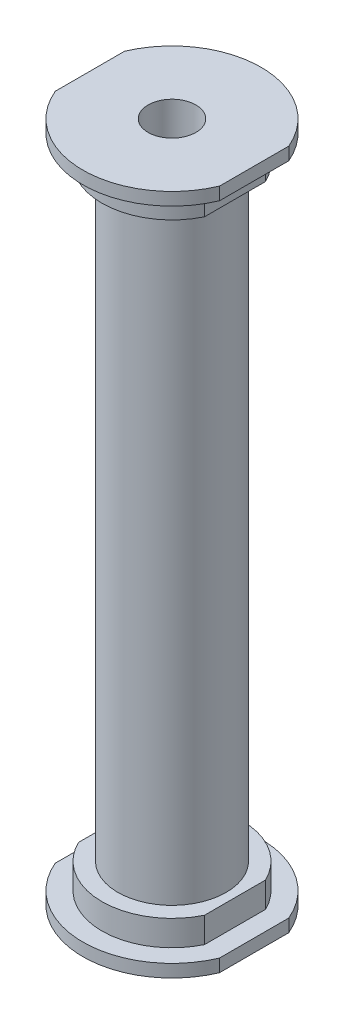
ISO-10303-21;
HEADER;
FILE_DESCRIPTION(('STEP AP214'),'2;1');
FILE_NAME('part.step','',(''),(''),'','','');
FILE_SCHEMA(('AUTOMOTIVE_DESIGN { 1 0 10303 214 1 1 1 1 }'));
ENDSEC;
DATA;
#1=APPLICATION_CONTEXT('core data for automotive mechanical design processes');
#2=APPLICATION_PROTOCOL_DEFINITION('international standard','automotive_design',2000,#1);
#3=PRODUCT_CONTEXT('',#1,'mechanical');
#4=PRODUCT('Part','Part','',(#3));
#5=PRODUCT_RELATED_PRODUCT_CATEGORY('part','',(#4));
#6=PRODUCT_DEFINITION_FORMATION('','',#4);
#7=PRODUCT_DEFINITION_CONTEXT('part definition',#1,'design');
#8=PRODUCT_DEFINITION('design','',#6,#7);
#9=PRODUCT_DEFINITION_SHAPE('','',#8);
#10=(LENGTH_UNIT() NAMED_UNIT(*) SI_UNIT(.MILLI.,.METRE.));
#11=(NAMED_UNIT(*) PLANE_ANGLE_UNIT() SI_UNIT($,.RADIAN.));
#12=(NAMED_UNIT(*) SI_UNIT($,.STERADIAN.) SOLID_ANGLE_UNIT());
#13=UNCERTAINTY_MEASURE_WITH_UNIT(LENGTH_MEASURE(1.E-05),#10,'distance_accuracy_value','');
#14=(GEOMETRIC_REPRESENTATION_CONTEXT(3) GLOBAL_UNCERTAINTY_ASSIGNED_CONTEXT((#13)) GLOBAL_UNIT_ASSIGNED_CONTEXT((#10,
#11,#12)) REPRESENTATION_CONTEXT('',''));
#15=CARTESIAN_POINT('',(0.,0.,0.));
#16=DIRECTION('',(0.,0.,1.));
#17=DIRECTION('',(1.,0.,0.));
#18=AXIS2_PLACEMENT_3D('',#15,#16,#17);
#19=CARTESIAN_POINT('',(0.,83.35,0.));
#20=DIRECTION('',(0.,-1.,0.));
#21=DIRECTION('',(-1.,0.,0.));
#22=AXIS2_PLACEMENT_3D('',#19,#20,#21);
#23=CYLINDRICAL_SURFACE('',#22,3.75);
#24=CARTESIAN_POINT('',(0.,54.35,0.));
#25=DIRECTION('',(0.,1.,0.));
#26=DIRECTION('',(-1.,0.,0.));
#27=AXIS2_PLACEMENT_3D('',#24,#25,#26);
#28=CIRCLE('',#27,3.75);
#29=CARTESIAN_POINT('',(-3.75,54.35,0.));
#30=VERTEX_POINT('',#29);
#31=EDGE_CURVE('E252',#30,#30,#28,.T.);
#32=ORIENTED_EDGE('',*,*,#31,.T.);
#33=EDGE_LOOP('',(#32));
#34=FACE_BOUND('',#33,.T.);
#35=CARTESIAN_POINT('',(0.,-52.65,0.));
#36=DIRECTION('',(0.,1.,0.));
#37=DIRECTION('',(-1.,0.,0.));
#38=AXIS2_PLACEMENT_3D('',#35,#36,#37);
#39=CIRCLE('',#38,3.75);
#40=CARTESIAN_POINT('',(-3.75,-52.65,0.));
#41=VERTEX_POINT('',#40);
#42=EDGE_CURVE('E208',#41,#41,#39,.T.);
#43=ORIENTED_EDGE('',*,*,#42,.F.);
#44=EDGE_LOOP('',(#43));
#45=FACE_BOUND('',#44,.T.);
#46=ADVANCED_FACE('F51',(#34,#45),#23,.F.);
#47=CARTESIAN_POINT('',(0.,48.35,0.));
#48=DIRECTION('',(0.,1.,0.));
#49=DIRECTION('',(-1.,0.,0.));
#50=AXIS2_PLACEMENT_3D('',#47,#48,#49);
#51=PLANE('',#50);
#52=CARTESIAN_POINT('',(0.,48.35,0.));
#53=DIRECTION('',(0.,-1.,0.));
#54=DIRECTION('',(1.,0.,0.));
#55=AXIS2_PLACEMENT_3D('',#52,#53,#54);
#56=CIRCLE('',#55,8.5);
#57=CARTESIAN_POINT('',(8.5,48.35,0.));
#58=VERTEX_POINT('',#57);
#59=EDGE_CURVE('E11',#58,#58,#56,.T.);
#60=ORIENTED_EDGE('',*,*,#59,.F.);
#61=EDGE_LOOP('',(#60));
#62=FACE_BOUND('',#61,.T.);
#63=CARTESIAN_POINT('',(0.,48.35,0.));
#64=DIRECTION('',(0.,1.,0.));
#65=DIRECTION('',(-1.,0.,0.));
#66=AXIS2_PLACEMENT_3D('',#63,#64,#65);
#67=CIRCLE('',#66,11.);
#68=CARTESIAN_POINT('',(-9.89999999999999,48.35,4.79478883789479));
#69=VERTEX_POINT('',#68);
#70=CARTESIAN_POINT('',(9.90000000000001,48.35,4.79478883789478));
#71=VERTEX_POINT('',#70);
#72=EDGE_CURVE('E286',#69,#71,#67,.T.);
#73=ORIENTED_EDGE('',*,*,#72,.F.);
#74=DIRECTION('',(0.,0.,1.));
#75=VECTOR('',#74,1.);
#76=CARTESIAN_POINT('',(-9.89999999999999,48.35,4.79478883789479));
#77=LINE('',#76,#75);
#78=CARTESIAN_POINT('',(-9.89999999999999,48.35,-4.79478883789479));
#79=VERTEX_POINT('',#78);
#80=EDGE_CURVE('E89',#79,#69,#77,.T.);
#81=ORIENTED_EDGE('',*,*,#80,.F.);
#82=CARTESIAN_POINT('',(0.,48.35,0.));
#83=DIRECTION('',(0.,1.,0.));
#84=DIRECTION('',(1.,0.,0.));
#85=AXIS2_PLACEMENT_3D('',#82,#83,#84);
#86=CIRCLE('',#85,11.);
#87=CARTESIAN_POINT('',(9.90000000000001,48.35,-4.79478883789479));
#88=VERTEX_POINT('',#87);
#89=EDGE_CURVE('E84',#88,#79,#86,.T.);
#90=ORIENTED_EDGE('',*,*,#89,.F.);
#91=DIRECTION('',(0.,0.,-1.));
#92=VECTOR('',#91,1.);
#93=CARTESIAN_POINT('',(9.90000000000001,48.35,-4.79478883789478));
#94=LINE('',#93,#92);
#95=EDGE_CURVE('E300',#71,#88,#94,.T.);
#96=ORIENTED_EDGE('',*,*,#95,.F.);
#97=EDGE_LOOP('',(#73,#81,#90,#96));
#98=FACE_BOUND('',#97,.T.);
#99=ADVANCED_FACE('F311',(#62,#98),#51,.F.);
#100=CARTESIAN_POINT('',(0.,52.35,0.));
#101=DIRECTION('',(0.,-1.,0.));
#102=DIRECTION('',(1.,0.,0.));
#103=AXIS2_PLACEMENT_3D('',#100,#101,#102);
#104=CYLINDRICAL_SURFACE('',#103,11.);
#105=ORIENTED_EDGE('',*,*,#72,.T.);
#106=DIRECTION('',(0.,-1.,0.));
#107=VECTOR('',#106,1.);
#108=CARTESIAN_POINT('',(9.90000000000001,52.35,4.79478883789478));
#109=LINE('',#108,#107);
#110=CARTESIAN_POINT('',(9.90000000000001,52.35,4.79478883789478));
#111=VERTEX_POINT('',#110);
#112=EDGE_CURVE('E54',#111,#71,#109,.T.);
#113=ORIENTED_EDGE('',*,*,#112,.F.);
#114=CARTESIAN_POINT('',(0.,52.35,0.));
#115=DIRECTION('',(0.,1.,0.));
#116=DIRECTION('',(-1.,0.,0.));
#117=AXIS2_PLACEMENT_3D('',#114,#115,#116);
#118=CIRCLE('',#117,11.);
#119=CARTESIAN_POINT('',(-9.89999999999999,52.35,4.79478883789479));
#120=VERTEX_POINT('',#119);
#121=EDGE_CURVE('E287',#120,#111,#118,.T.);
#122=ORIENTED_EDGE('',*,*,#121,.F.);
#123=DIRECTION('',(0.,-1.,0.));
#124=VECTOR('',#123,1.);
#125=CARTESIAN_POINT('',(-9.89999999999999,52.35,4.79478883789479));
#126=LINE('',#125,#124);
#127=EDGE_CURVE('E297',#120,#69,#126,.T.);
#128=ORIENTED_EDGE('',*,*,#127,.T.);
#129=EDGE_LOOP('',(#105,#113,#122,#128));
#130=FACE_BOUND('',#129,.T.);
#131=ADVANCED_FACE('F309',(#130),#104,.T.);
#132=CARTESIAN_POINT('',(9.90000000000001,52.35,-4.79478883789478));
#133=DIRECTION('',(-1.,0.,0.));
#134=DIRECTION('',(0.,-1.,0.));
#135=AXIS2_PLACEMENT_3D('',#132,#133,#134);
#136=PLANE('',#135);
#137=ORIENTED_EDGE('',*,*,#95,.T.);
#138=DIRECTION('',(0.,-1.,0.));
#139=VECTOR('',#138,1.);
#140=CARTESIAN_POINT('',(9.90000000000001,52.35,-4.79478883789479));
#141=LINE('',#140,#139);
#142=CARTESIAN_POINT('',(9.90000000000001,52.35,-4.79478883789479));
#143=VERTEX_POINT('',#142);
#144=EDGE_CURVE('E305',#143,#88,#141,.T.);
#145=ORIENTED_EDGE('',*,*,#144,.F.);
#146=DIRECTION('',(0.,0.,-1.));
#147=VECTOR('',#146,1.);
#148=CARTESIAN_POINT('',(9.90000000000001,52.35,-4.79478883789478));
#149=LINE('',#148,#147);
#150=EDGE_CURVE('E95',#111,#143,#149,.T.);
#151=ORIENTED_EDGE('',*,*,#150,.F.);
#152=ORIENTED_EDGE('',*,*,#112,.T.);
#153=EDGE_LOOP('',(#137,#145,#151,#152));
#154=FACE_BOUND('',#153,.T.);
#155=ADVANCED_FACE('F306',(#154),#136,.F.);
#156=CARTESIAN_POINT('',(0.,52.35,0.));
#157=DIRECTION('',(0.,-1.,0.));
#158=DIRECTION('',(1.,0.,0.));
#159=AXIS2_PLACEMENT_3D('',#156,#157,#158);
#160=CYLINDRICAL_SURFACE('',#159,11.);
#161=ORIENTED_EDGE('',*,*,#89,.T.);
#162=DIRECTION('',(0.,-1.,0.));
#163=VECTOR('',#162,1.);
#164=CARTESIAN_POINT('',(-9.89999999999999,52.35,-4.79478883789479));
#165=LINE('',#164,#163);
#166=CARTESIAN_POINT('',(-9.89999999999999,52.35,-4.79478883789479));
#167=VERTEX_POINT('',#166);
#168=EDGE_CURVE('E68',#167,#79,#165,.T.);
#169=ORIENTED_EDGE('',*,*,#168,.F.);
#170=CARTESIAN_POINT('',(0.,52.35,0.));
#171=DIRECTION('',(0.,1.,0.));
#172=DIRECTION('',(1.,0.,0.));
#173=AXIS2_PLACEMENT_3D('',#170,#171,#172);
#174=CIRCLE('',#173,11.);
#175=EDGE_CURVE('E291',#143,#167,#174,.T.);
#176=ORIENTED_EDGE('',*,*,#175,.F.);
#177=ORIENTED_EDGE('',*,*,#144,.T.);
#178=EDGE_LOOP('',(#161,#169,#176,#177));
#179=FACE_BOUND('',#178,.T.);
#180=ADVANCED_FACE('F329',(#179),#160,.T.);
#181=CARTESIAN_POINT('',(-9.89999999999999,52.35,4.79478883789479));
#182=DIRECTION('',(1.,0.,0.));
#183=DIRECTION('',(0.,1.,0.));
#184=AXIS2_PLACEMENT_3D('',#181,#182,#183);
#185=PLANE('',#184);
#186=ORIENTED_EDGE('',*,*,#80,.T.);
#187=ORIENTED_EDGE('',*,*,#127,.F.);
#188=DIRECTION('',(0.,0.,1.));
#189=VECTOR('',#188,1.);
#190=CARTESIAN_POINT('',(-9.89999999999999,52.35,4.79478883789479));
#191=LINE('',#190,#189);
#192=EDGE_CURVE('E294',#167,#120,#191,.T.);
#193=ORIENTED_EDGE('',*,*,#192,.F.);
#194=ORIENTED_EDGE('',*,*,#168,.T.);
#195=EDGE_LOOP('',(#186,#187,#193,#194));
#196=FACE_BOUND('',#195,.T.);
#197=ADVANCED_FACE('F325',(#196),#185,.F.);
#198=CARTESIAN_POINT('',(0.,52.35,0.));
#199=DIRECTION('',(0.,1.,0.));
#200=DIRECTION('',(-1.,0.,0.));
#201=AXIS2_PLACEMENT_3D('',#198,#199,#200);
#202=PLANE('',#201);
#203=CARTESIAN_POINT('',(0.,52.35,0.));
#204=DIRECTION('',(0.,1.,0.));
#205=DIRECTION('',(-1.,0.,0.));
#206=AXIS2_PLACEMENT_3D('',#203,#204,#205);
#207=CIRCLE('',#206,14.);
#208=CARTESIAN_POINT('',(-12.9,52.35,5.43966910758371));
#209=VERTEX_POINT('',#208);
#210=CARTESIAN_POINT('',(12.9,52.35,5.4396691075837));
#211=VERTEX_POINT('',#210);
#212=EDGE_CURVE('E256',#209,#211,#207,.T.);
#213=ORIENTED_EDGE('',*,*,#212,.F.);
#214=DIRECTION('',(0.,0.,1.));
#215=VECTOR('',#214,1.);
#216=CARTESIAN_POINT('',(-12.9,52.35,5.43966910758371));
#217=LINE('',#216,#215);
#218=CARTESIAN_POINT('',(-12.9,52.35,-5.43966910758372));
#219=VERTEX_POINT('',#218);
#220=EDGE_CURVE('E261',#219,#209,#217,.T.);
#221=ORIENTED_EDGE('',*,*,#220,.F.);
#222=CARTESIAN_POINT('',(0.,52.35,0.));
#223=DIRECTION('',(0.,1.,0.));
#224=DIRECTION('',(1.,0.,0.));
#225=AXIS2_PLACEMENT_3D('',#222,#223,#224);
#226=CIRCLE('',#225,14.);
#227=CARTESIAN_POINT('',(12.9,52.35,-5.4396691075837));
#228=VERTEX_POINT('',#227);
#229=EDGE_CURVE('E272',#228,#219,#226,.T.);
#230=ORIENTED_EDGE('',*,*,#229,.F.);
#231=DIRECTION('',(0.,0.,-1.));
#232=VECTOR('',#231,1.);
#233=CARTESIAN_POINT('',(12.9,52.35,-5.4396691075837));
#234=LINE('',#233,#232);
#235=EDGE_CURVE('E270',#211,#228,#234,.T.);
#236=ORIENTED_EDGE('',*,*,#235,.F.);
#237=EDGE_LOOP('',(#213,#221,#230,#236));
#238=FACE_BOUND('',#237,.T.);
#239=ORIENTED_EDGE('',*,*,#192,.T.);
#240=ORIENTED_EDGE('',*,*,#121,.T.);
#241=ORIENTED_EDGE('',*,*,#150,.T.);
#242=ORIENTED_EDGE('',*,*,#175,.T.);
#243=EDGE_LOOP('',(#239,#240,#241,#242));
#244=FACE_BOUND('',#243,.T.);
#245=ADVANCED_FACE('F328',(#238,#244),#202,.F.);
#246=CARTESIAN_POINT('',(0.,54.35,0.));
#247=DIRECTION('',(0.,1.,0.));
#248=DIRECTION('',(-1.,0.,0.));
#249=AXIS2_PLACEMENT_3D('',#246,#247,#248);
#250=PLANE('',#249);
#251=CARTESIAN_POINT('',(0.,54.35,0.));
#252=DIRECTION('',(0.,1.,0.));
#253=DIRECTION('',(-1.,0.,0.));
#254=AXIS2_PLACEMENT_3D('',#251,#252,#253);
#255=CIRCLE('',#254,14.);
#256=CARTESIAN_POINT('',(-12.9,54.35,5.43966910758371));
#257=VERTEX_POINT('',#256);
#258=CARTESIAN_POINT('',(12.9,54.35,5.4396691075837));
#259=VERTEX_POINT('',#258);
#260=EDGE_CURVE('E257',#257,#259,#255,.T.);
#261=ORIENTED_EDGE('',*,*,#260,.T.);
#262=DIRECTION('',(0.,0.,-1.));
#263=VECTOR('',#262,1.);
#264=CARTESIAN_POINT('',(12.9,54.35,-5.4396691075837));
#265=LINE('',#264,#263);
#266=CARTESIAN_POINT('',(12.9,54.35,-5.4396691075837));
#267=VERTEX_POINT('',#266);
#268=EDGE_CURVE('E260',#259,#267,#265,.T.);
#269=ORIENTED_EDGE('',*,*,#268,.T.);
#270=CARTESIAN_POINT('',(0.,54.35,0.));
#271=DIRECTION('',(0.,1.,0.));
#272=DIRECTION('',(1.,0.,0.));
#273=AXIS2_PLACEMENT_3D('',#270,#271,#272);
#274=CIRCLE('',#273,14.);
#275=CARTESIAN_POINT('',(-12.9,54.35,-5.43966910758372));
#276=VERTEX_POINT('',#275);
#277=EDGE_CURVE('E263',#267,#276,#274,.T.);
#278=ORIENTED_EDGE('',*,*,#277,.T.);
#279=DIRECTION('',(0.,0.,1.));
#280=VECTOR('',#279,1.);
#281=CARTESIAN_POINT('',(-12.9,54.35,5.43966910758371));
#282=LINE('',#281,#280);
#283=EDGE_CURVE('E265',#276,#257,#282,.T.);
#284=ORIENTED_EDGE('',*,*,#283,.T.);
#285=EDGE_LOOP('',(#261,#269,#278,#284));
#286=FACE_BOUND('',#285,.T.);
#287=ORIENTED_EDGE('',*,*,#31,.F.);
#288=EDGE_LOOP('',(#287));
#289=FACE_BOUND('',#288,.T.);
#290=ADVANCED_FACE('F351',(#286,#289),#250,.T.);
#291=CARTESIAN_POINT('',(0.,54.35,0.));
#292=DIRECTION('',(0.,-1.,0.));
#293=DIRECTION('',(1.,0.,0.));
#294=AXIS2_PLACEMENT_3D('',#291,#292,#293);
#295=CYLINDRICAL_SURFACE('',#294,14.);
#296=ORIENTED_EDGE('',*,*,#212,.T.);
#297=DIRECTION('',(0.,-1.,0.));
#298=VECTOR('',#297,1.);
#299=CARTESIAN_POINT('',(12.9,54.35,5.4396691075837));
#300=LINE('',#299,#298);
#301=EDGE_CURVE('E283',#259,#211,#300,.T.);
#302=ORIENTED_EDGE('',*,*,#301,.F.);
#303=ORIENTED_EDGE('',*,*,#260,.F.);
#304=DIRECTION('',(0.,-1.,0.));
#305=VECTOR('',#304,1.);
#306=CARTESIAN_POINT('',(-12.9,54.35,5.43966910758371));
#307=LINE('',#306,#305);
#308=EDGE_CURVE('E267',#257,#209,#307,.T.);
#309=ORIENTED_EDGE('',*,*,#308,.T.);
#310=EDGE_LOOP('',(#296,#302,#303,#309));
#311=FACE_BOUND('',#310,.T.);
#312=ADVANCED_FACE('F323',(#311),#295,.T.);
#313=CARTESIAN_POINT('',(12.9,54.35,-5.4396691075837));
#314=DIRECTION('',(-1.,0.,0.));
#315=DIRECTION('',(0.,-1.,0.));
#316=AXIS2_PLACEMENT_3D('',#313,#314,#315);
#317=PLANE('',#316);
#318=ORIENTED_EDGE('',*,*,#235,.T.);
#319=DIRECTION('',(0.,-1.,0.));
#320=VECTOR('',#319,1.);
#321=CARTESIAN_POINT('',(12.9,54.35,-5.4396691075837));
#322=LINE('',#321,#320);
#323=EDGE_CURVE('E280',#267,#228,#322,.T.);
#324=ORIENTED_EDGE('',*,*,#323,.F.);
#325=ORIENTED_EDGE('',*,*,#268,.F.);
#326=ORIENTED_EDGE('',*,*,#301,.T.);
#327=EDGE_LOOP('',(#318,#324,#325,#326));
#328=FACE_BOUND('',#327,.T.);
#329=ADVANCED_FACE('F366',(#328),#317,.F.);
#330=CARTESIAN_POINT('',(0.,54.35,0.));
#331=DIRECTION('',(0.,-1.,0.));
#332=DIRECTION('',(1.,0.,0.));
#333=AXIS2_PLACEMENT_3D('',#330,#331,#332);
#334=CYLINDRICAL_SURFACE('',#333,14.);
#335=ORIENTED_EDGE('',*,*,#229,.T.);
#336=DIRECTION('',(0.,-1.,0.));
#337=VECTOR('',#336,1.);
#338=CARTESIAN_POINT('',(-12.9,54.35,-5.43966910758372));
#339=LINE('',#338,#337);
#340=EDGE_CURVE('E277',#276,#219,#339,.T.);
#341=ORIENTED_EDGE('',*,*,#340,.F.);
#342=ORIENTED_EDGE('',*,*,#277,.F.);
#343=ORIENTED_EDGE('',*,*,#323,.T.);
#344=EDGE_LOOP('',(#335,#341,#342,#343));
#345=FACE_BOUND('',#344,.T.);
#346=ADVANCED_FACE('F373',(#345),#334,.T.);
#347=CARTESIAN_POINT('',(-12.9,54.35,5.43966910758371));
#348=DIRECTION('',(1.,0.,0.));
#349=DIRECTION('',(0.,1.,0.));
#350=AXIS2_PLACEMENT_3D('',#347,#348,#349);
#351=PLANE('',#350);
#352=ORIENTED_EDGE('',*,*,#220,.T.);
#353=ORIENTED_EDGE('',*,*,#308,.F.);
#354=ORIENTED_EDGE('',*,*,#283,.F.);
#355=ORIENTED_EDGE('',*,*,#340,.T.);
#356=EDGE_LOOP('',(#352,#353,#354,#355));
#357=FACE_BOUND('',#356,.T.);
#358=ADVANCED_FACE('F380',(#357),#351,.F.);
#359=CARTESIAN_POINT('',(0.,-46.65,0.));
#360=DIRECTION('',(0.,1.,0.));
#361=DIRECTION('',(-1.,0.,0.));
#362=AXIS2_PLACEMENT_3D('',#359,#360,#361);
#363=CYLINDRICAL_SURFACE('',#362,8.5);
#364=CARTESIAN_POINT('',(0.,-46.65,0.));
#365=DIRECTION('',(0.,-1.,0.));
#366=DIRECTION('',(1.,0.,0.));
#367=AXIS2_PLACEMENT_3D('',#364,#365,#366);
#368=CIRCLE('',#367,8.5);
#369=CARTESIAN_POINT('',(8.5,-46.65,0.));
#370=VERTEX_POINT('',#369);
#371=EDGE_CURVE('E250',#370,#370,#368,.T.);
#372=ORIENTED_EDGE('',*,*,#371,.F.);
#373=EDGE_LOOP('',(#372));
#374=FACE_BOUND('',#373,.T.);
#375=ORIENTED_EDGE('',*,*,#59,.T.);
#376=EDGE_LOOP('',(#375));
#377=FACE_BOUND('',#376,.T.);
#378=ADVANCED_FACE('F388',(#374,#377),#363,.T.);
#379=CARTESIAN_POINT('',(0.,-50.65,0.));
#380=DIRECTION('',(0.,1.,0.));
#381=DIRECTION('',(-1.,0.,0.));
#382=AXIS2_PLACEMENT_3D('',#379,#380,#381);
#383=CYLINDRICAL_SURFACE('',#382,11.);
#384=CARTESIAN_POINT('',(0.,-46.65,0.));
#385=DIRECTION('',(0.,1.,0.));
#386=DIRECTION('',(-1.,0.,0.));
#387=AXIS2_PLACEMENT_3D('',#384,#385,#386);
#388=CIRCLE('',#387,11.);
#389=CARTESIAN_POINT('',(-9.9,-46.65,4.79478883789479));
#390=VERTEX_POINT('',#389);
#391=CARTESIAN_POINT('',(9.9,-46.65,4.79478883789478));
#392=VERTEX_POINT('',#391);
#393=EDGE_CURVE('E185',#390,#392,#388,.T.);
#394=ORIENTED_EDGE('',*,*,#393,.F.);
#395=DIRECTION('',(0.,1.,0.));
#396=VECTOR('',#395,1.);
#397=CARTESIAN_POINT('',(-9.9,-50.65,4.79478883789479));
#398=LINE('',#397,#396);
#399=CARTESIAN_POINT('',(-9.9,-50.65,4.79478883789479));
#400=VERTEX_POINT('',#399);
#401=EDGE_CURVE('E248',#400,#390,#398,.T.);
#402=ORIENTED_EDGE('',*,*,#401,.F.);
#403=CARTESIAN_POINT('',(0.,-50.65,0.));
#404=DIRECTION('',(0.,1.,0.));
#405=DIRECTION('',(-1.,0.,0.));
#406=AXIS2_PLACEMENT_3D('',#403,#404,#405);
#407=CIRCLE('',#406,11.);
#408=CARTESIAN_POINT('',(9.9,-50.65,4.79478883789478));
#409=VERTEX_POINT('',#408);
#410=EDGE_CURVE('E219',#400,#409,#407,.T.);
#411=ORIENTED_EDGE('',*,*,#410,.T.);
#412=DIRECTION('',(0.,1.,0.));
#413=VECTOR('',#412,1.);
#414=CARTESIAN_POINT('',(9.9,-50.65,4.79478883789478));
#415=LINE('',#414,#413);
#416=EDGE_CURVE('E232',#409,#392,#415,.T.);
#417=ORIENTED_EDGE('',*,*,#416,.T.);
#418=EDGE_LOOP('',(#394,#402,#411,#417));
#419=FACE_BOUND('',#418,.T.);
#420=ADVANCED_FACE('F396',(#419),#383,.T.);
#421=CARTESIAN_POINT('',(-9.9,-50.65,4.79478883789479));
#422=DIRECTION('',(-1.,0.,0.));
#423=DIRECTION('',(0.,-1.,0.));
#424=AXIS2_PLACEMENT_3D('',#421,#422,#423);
#425=PLANE('',#424);
#426=DIRECTION('',(0.,0.,1.));
#427=VECTOR('',#426,1.);
#428=CARTESIAN_POINT('',(-9.9,-46.65,4.79478883789479));
#429=LINE('',#428,#427);
#430=CARTESIAN_POINT('',(-9.9,-46.65,-4.79478883789479));
#431=VERTEX_POINT('',#430);
#432=EDGE_CURVE('E235',#431,#390,#429,.T.);
#433=ORIENTED_EDGE('',*,*,#432,.F.);
#434=DIRECTION('',(0.,1.,0.));
#435=VECTOR('',#434,1.);
#436=CARTESIAN_POINT('',(-9.9,-50.65,-4.79478883789479));
#437=LINE('',#436,#435);
#438=CARTESIAN_POINT('',(-9.9,-50.65,-4.79478883789479));
#439=VERTEX_POINT('',#438);
#440=EDGE_CURVE('E246',#439,#431,#437,.T.);
#441=ORIENTED_EDGE('',*,*,#440,.F.);
#442=DIRECTION('',(0.,0.,1.));
#443=VECTOR('',#442,1.);
#444=CARTESIAN_POINT('',(-9.9,-50.65,4.79478883789479));
#445=LINE('',#444,#443);
#446=EDGE_CURVE('E222',#439,#400,#445,.T.);
#447=ORIENTED_EDGE('',*,*,#446,.T.);
#448=ORIENTED_EDGE('',*,*,#401,.T.);
#449=EDGE_LOOP('',(#433,#441,#447,#448));
#450=FACE_BOUND('',#449,.T.);
#451=ADVANCED_FACE('F405',(#450),#425,.T.);
#452=CARTESIAN_POINT('',(0.,-50.65,0.));
#453=DIRECTION('',(0.,1.,0.));
#454=DIRECTION('',(-1.,0.,0.));
#455=AXIS2_PLACEMENT_3D('',#452,#453,#454);
#456=CYLINDRICAL_SURFACE('',#455,11.);
#457=CARTESIAN_POINT('',(0.,-46.65,0.));
#458=DIRECTION('',(0.,1.,0.));
#459=DIRECTION('',(1.,0.,0.));
#460=AXIS2_PLACEMENT_3D('',#457,#458,#459);
#461=CIRCLE('',#460,11.);
#462=CARTESIAN_POINT('',(9.9,-46.65,-4.79478883789479));
#463=VERTEX_POINT('',#462);
#464=EDGE_CURVE('E238',#463,#431,#461,.T.);
#465=ORIENTED_EDGE('',*,*,#464,.F.);
#466=DIRECTION('',(0.,1.,0.));
#467=VECTOR('',#466,1.);
#468=CARTESIAN_POINT('',(9.9,-50.65,-4.79478883789479));
#469=LINE('',#468,#467);
#470=CARTESIAN_POINT('',(9.9,-50.65,-4.79478883789479));
#471=VERTEX_POINT('',#470);
#472=EDGE_CURVE('E244',#471,#463,#469,.T.);
#473=ORIENTED_EDGE('',*,*,#472,.F.);
#474=CARTESIAN_POINT('',(0.,-50.65,0.));
#475=DIRECTION('',(0.,1.,0.));
#476=DIRECTION('',(1.,0.,0.));
#477=AXIS2_PLACEMENT_3D('',#474,#475,#476);
#478=CIRCLE('',#477,11.);
#479=EDGE_CURVE('E226',#471,#439,#478,.T.);
#480=ORIENTED_EDGE('',*,*,#479,.T.);
#481=ORIENTED_EDGE('',*,*,#440,.T.);
#482=EDGE_LOOP('',(#465,#473,#480,#481));
#483=FACE_BOUND('',#482,.T.);
#484=ADVANCED_FACE('F413',(#483),#456,.T.);
#485=CARTESIAN_POINT('',(9.9,-50.65,-4.79478883789478));
#486=DIRECTION('',(1.,0.,0.));
#487=DIRECTION('',(0.,1.,0.));
#488=AXIS2_PLACEMENT_3D('',#485,#486,#487);
#489=PLANE('',#488);
#490=DIRECTION('',(0.,0.,-1.));
#491=VECTOR('',#490,1.);
#492=CARTESIAN_POINT('',(9.9,-46.65,-4.79478883789478));
#493=LINE('',#492,#491);
#494=EDGE_CURVE('E223',#392,#463,#493,.T.);
#495=ORIENTED_EDGE('',*,*,#494,.F.);
#496=ORIENTED_EDGE('',*,*,#416,.F.);
#497=DIRECTION('',(0.,0.,-1.));
#498=VECTOR('',#497,1.);
#499=CARTESIAN_POINT('',(9.9,-50.65,-4.79478883789478));
#500=LINE('',#499,#498);
#501=EDGE_CURVE('E229',#409,#471,#500,.T.);
#502=ORIENTED_EDGE('',*,*,#501,.T.);
#503=ORIENTED_EDGE('',*,*,#472,.T.);
#504=EDGE_LOOP('',(#495,#496,#502,#503));
#505=FACE_BOUND('',#504,.T.);
#506=ADVANCED_FACE('F421',(#505),#489,.T.);
#507=CARTESIAN_POINT('',(0.,-46.65,0.));
#508=DIRECTION('',(0.,-1.,0.));
#509=DIRECTION('',(-1.,0.,0.));
#510=AXIS2_PLACEMENT_3D('',#507,#508,#509);
#511=PLANE('',#510);
#512=ORIENTED_EDGE('',*,*,#371,.T.);
#513=EDGE_LOOP('',(#512));
#514=FACE_BOUND('',#513,.T.);
#515=ORIENTED_EDGE('',*,*,#393,.T.);
#516=ORIENTED_EDGE('',*,*,#494,.T.);
#517=ORIENTED_EDGE('',*,*,#464,.T.);
#518=ORIENTED_EDGE('',*,*,#432,.T.);
#519=EDGE_LOOP('',(#515,#516,#517,#518));
#520=FACE_BOUND('',#519,.T.);
#521=ADVANCED_FACE('F429',(#514,#520),#511,.F.);
#522=CARTESIAN_POINT('',(0.,-52.65,0.));
#523=DIRECTION('',(0.,1.,0.));
#524=DIRECTION('',(-1.,0.,0.));
#525=AXIS2_PLACEMENT_3D('',#522,#523,#524);
#526=CYLINDRICAL_SURFACE('',#525,14.);
#527=CARTESIAN_POINT('',(0.,-50.65,0.));
#528=DIRECTION('',(0.,1.,0.));
#529=DIRECTION('',(-1.,0.,0.));
#530=AXIS2_PLACEMENT_3D('',#527,#528,#529);
#531=CIRCLE('',#530,14.);
#532=CARTESIAN_POINT('',(-12.9,-50.65,5.43966910758371));
#533=VERTEX_POINT('',#532);
#534=CARTESIAN_POINT('',(12.9,-50.65,5.4396691075837));
#535=VERTEX_POINT('',#534);
#536=EDGE_CURVE('E180',#533,#535,#531,.T.);
#537=ORIENTED_EDGE('',*,*,#536,.F.);
#538=DIRECTION('',(0.,1.,0.));
#539=VECTOR('',#538,1.);
#540=CARTESIAN_POINT('',(-12.9,-52.65,5.43966910758371));
#541=LINE('',#540,#539);
#542=CARTESIAN_POINT('',(-12.9,-52.65,5.43966910758371));
#543=VERTEX_POINT('',#542);
#544=EDGE_CURVE('E174',#543,#533,#541,.T.);
#545=ORIENTED_EDGE('',*,*,#544,.F.);
#546=CARTESIAN_POINT('',(0.,-52.65,0.));
#547=DIRECTION('',(0.,1.,0.));
#548=DIRECTION('',(-1.,0.,0.));
#549=AXIS2_PLACEMENT_3D('',#546,#547,#548);
#550=CIRCLE('',#549,14.);
#551=CARTESIAN_POINT('',(12.9,-52.65,5.4396691075837));
#552=VERTEX_POINT('',#551);
#553=EDGE_CURVE('E177',#543,#552,#550,.T.);
#554=ORIENTED_EDGE('',*,*,#553,.T.);
#555=DIRECTION('',(0.,1.,0.));
#556=VECTOR('',#555,1.);
#557=CARTESIAN_POINT('',(12.9,-52.65,5.4396691075837));
#558=LINE('',#557,#556);
#559=EDGE_CURVE('E205',#552,#535,#558,.T.);
#560=ORIENTED_EDGE('',*,*,#559,.T.);
#561=EDGE_LOOP('',(#537,#545,#554,#560));
#562=FACE_BOUND('',#561,.T.);
#563=ADVANCED_FACE('F176',(#562),#526,.T.);
#564=CARTESIAN_POINT('',(-12.9,-52.65,5.43966910758371));
#565=DIRECTION('',(-1.,0.,0.));
#566=DIRECTION('',(0.,-1.,0.));
#567=AXIS2_PLACEMENT_3D('',#564,#565,#566);
#568=PLANE('',#567);
#569=DIRECTION('',(0.,0.,1.));
#570=VECTOR('',#569,1.);
#571=CARTESIAN_POINT('',(-12.9,-50.65,5.43966910758371));
#572=LINE('',#571,#570);
#573=CARTESIAN_POINT('',(-12.9,-50.65,-5.43966910758372));
#574=VERTEX_POINT('',#573);
#575=EDGE_CURVE('E207',#574,#533,#572,.T.);
#576=ORIENTED_EDGE('',*,*,#575,.F.);
#577=DIRECTION('',(0.,1.,0.));
#578=VECTOR('',#577,1.);
#579=CARTESIAN_POINT('',(-12.9,-52.65,-5.43966910758372));
#580=LINE('',#579,#578);
#581=CARTESIAN_POINT('',(-12.9,-52.65,-5.43966910758372));
#582=VERTEX_POINT('',#581);
#583=EDGE_CURVE('E186',#582,#574,#580,.T.);
#584=ORIENTED_EDGE('',*,*,#583,.F.);
#585=DIRECTION('',(0.,0.,1.));
#586=VECTOR('',#585,1.);
#587=CARTESIAN_POINT('',(-12.9,-52.65,5.43966910758371));
#588=LINE('',#587,#586);
#589=EDGE_CURVE('E192',#582,#543,#588,.T.);
#590=ORIENTED_EDGE('',*,*,#589,.T.);
#591=ORIENTED_EDGE('',*,*,#544,.T.);
#592=EDGE_LOOP('',(#576,#584,#590,#591));
#593=FACE_BOUND('',#592,.T.);
#594=ADVANCED_FACE('F198',(#593),#568,.T.);
#595=CARTESIAN_POINT('',(0.,-52.65,0.));
#596=DIRECTION('',(0.,1.,0.));
#597=DIRECTION('',(-1.,0.,0.));
#598=AXIS2_PLACEMENT_3D('',#595,#596,#597);
#599=CYLINDRICAL_SURFACE('',#598,14.);
#600=CARTESIAN_POINT('',(0.,-50.65,0.));
#601=DIRECTION('',(0.,1.,0.));
#602=DIRECTION('',(1.,0.,0.));
#603=AXIS2_PLACEMENT_3D('',#600,#601,#602);
#604=CIRCLE('',#603,14.);
#605=CARTESIAN_POINT('',(12.9,-50.65,-5.4396691075837));
#606=VERTEX_POINT('',#605);
#607=EDGE_CURVE('E210',#606,#574,#604,.T.);
#608=ORIENTED_EDGE('',*,*,#607,.F.);
#609=DIRECTION('',(0.,1.,0.));
#610=VECTOR('',#609,1.);
#611=CARTESIAN_POINT('',(12.9,-52.65,-5.4396691075837));
#612=LINE('',#611,#610);
#613=CARTESIAN_POINT('',(12.9,-52.65,-5.4396691075837));
#614=VERTEX_POINT('',#613);
#615=EDGE_CURVE('E216',#614,#606,#612,.T.);
#616=ORIENTED_EDGE('',*,*,#615,.F.);
#617=CARTESIAN_POINT('',(0.,-52.65,0.));
#618=DIRECTION('',(0.,1.,0.));
#619=DIRECTION('',(1.,0.,0.));
#620=AXIS2_PLACEMENT_3D('',#617,#618,#619);
#621=CIRCLE('',#620,14.);
#622=EDGE_CURVE('E199',#614,#582,#621,.T.);
#623=ORIENTED_EDGE('',*,*,#622,.T.);
#624=ORIENTED_EDGE('',*,*,#583,.T.);
#625=EDGE_LOOP('',(#608,#616,#623,#624));
#626=FACE_BOUND('',#625,.T.);
#627=ADVANCED_FACE('F450',(#626),#599,.T.);
#628=CARTESIAN_POINT('',(12.9,-52.65,-5.4396691075837));
#629=DIRECTION('',(1.,0.,0.));
#630=DIRECTION('',(0.,1.,0.));
#631=AXIS2_PLACEMENT_3D('',#628,#629,#630);
#632=PLANE('',#631);
#633=DIRECTION('',(0.,0.,-1.));
#634=VECTOR('',#633,1.);
#635=CARTESIAN_POINT('',(12.9,-50.65,-5.4396691075837));
#636=LINE('',#635,#634);
#637=EDGE_CURVE('E196',#535,#606,#636,.T.);
#638=ORIENTED_EDGE('',*,*,#637,.F.);
#639=ORIENTED_EDGE('',*,*,#559,.F.);
#640=DIRECTION('',(0.,0.,-1.));
#641=VECTOR('',#640,1.);
#642=CARTESIAN_POINT('',(12.9,-52.65,-5.4396691075837));
#643=LINE('',#642,#641);
#644=EDGE_CURVE('E195',#552,#614,#643,.T.);
#645=ORIENTED_EDGE('',*,*,#644,.T.);
#646=ORIENTED_EDGE('',*,*,#615,.T.);
#647=EDGE_LOOP('',(#638,#639,#645,#646));
#648=FACE_BOUND('',#647,.T.);
#649=ADVANCED_FACE('F457',(#648),#632,.T.);
#650=CARTESIAN_POINT('',(0.,-52.65,0.));
#651=DIRECTION('',(0.,-1.,0.));
#652=DIRECTION('',(-1.,0.,0.));
#653=AXIS2_PLACEMENT_3D('',#650,#651,#652);
#654=PLANE('',#653);
#655=ORIENTED_EDGE('',*,*,#42,.T.);
#656=EDGE_LOOP('',(#655));
#657=FACE_BOUND('',#656,.T.);
#658=ORIENTED_EDGE('',*,*,#553,.F.);
#659=ORIENTED_EDGE('',*,*,#589,.F.);
#660=ORIENTED_EDGE('',*,*,#622,.F.);
#661=ORIENTED_EDGE('',*,*,#644,.F.);
#662=EDGE_LOOP('',(#658,#659,#660,#661));
#663=FACE_BOUND('',#662,.T.);
#664=ADVANCED_FACE('F190',(#657,#663),#654,.T.);
#665=CARTESIAN_POINT('',(0.,-50.65,0.));
#666=DIRECTION('',(0.,-1.,0.));
#667=DIRECTION('',(-1.,0.,0.));
#668=AXIS2_PLACEMENT_3D('',#665,#666,#667);
#669=PLANE('',#668);
#670=ORIENTED_EDGE('',*,*,#410,.F.);
#671=ORIENTED_EDGE('',*,*,#446,.F.);
#672=ORIENTED_EDGE('',*,*,#479,.F.);
#673=ORIENTED_EDGE('',*,*,#501,.F.);
#674=EDGE_LOOP('',(#670,#671,#672,#673));
#675=FACE_BOUND('',#674,.T.);
#676=ORIENTED_EDGE('',*,*,#536,.T.);
#677=ORIENTED_EDGE('',*,*,#637,.T.);
#678=ORIENTED_EDGE('',*,*,#607,.T.);
#679=ORIENTED_EDGE('',*,*,#575,.T.);
#680=EDGE_LOOP('',(#676,#677,#678,#679));
#681=FACE_BOUND('',#680,.T.);
#682=ADVANCED_FACE('F472',(#675,#681),#669,.F.);
#683=CLOSED_SHELL('',(#46,#99,#131,#155,#180,#197,#245,#290,#312,#329,#346,#358,#378,#420,#451,
#484,#506,#521,#563,#594,#627,#649,#664,#682));
#684=MANIFOLD_SOLID_BREP('B2',#683);
#685=ADVANCED_BREP_SHAPE_REPRESENTATION('',(#18,#684),#14);
#686=SHAPE_DEFINITION_REPRESENTATION(#9,#685);
ENDSEC;
END-ISO-10303-21;
